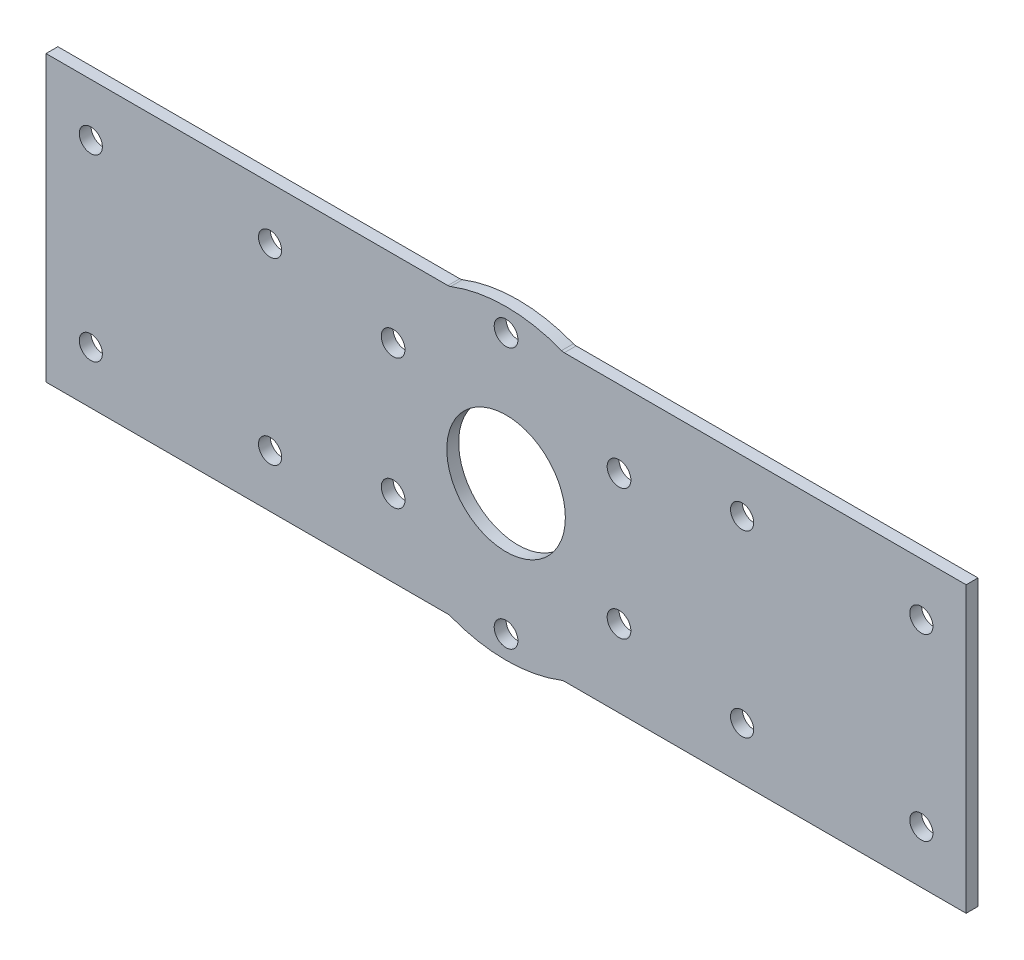
ISO-10303-21;
HEADER;
FILE_DESCRIPTION(('STEP AP214'),'2;1');
FILE_NAME('part.step','',(''),(''),'','','');
FILE_SCHEMA(('AUTOMOTIVE_DESIGN { 1 0 10303 214 1 1 1 1 }'));
ENDSEC;
DATA;
#1=APPLICATION_CONTEXT('core data for automotive mechanical design processes');
#2=APPLICATION_PROTOCOL_DEFINITION('international standard','automotive_design',2000,#1);
#3=PRODUCT_CONTEXT('',#1,'mechanical');
#4=PRODUCT('Part','Part','',(#3));
#5=PRODUCT_RELATED_PRODUCT_CATEGORY('part','',(#4));
#6=PRODUCT_DEFINITION_FORMATION('','',#4);
#7=PRODUCT_DEFINITION_CONTEXT('part definition',#1,'design');
#8=PRODUCT_DEFINITION('design','',#6,#7);
#9=PRODUCT_DEFINITION_SHAPE('','',#8);
#10=(LENGTH_UNIT() NAMED_UNIT(*) SI_UNIT(.MILLI.,.METRE.));
#11=(NAMED_UNIT(*) PLANE_ANGLE_UNIT() SI_UNIT($,.RADIAN.));
#12=(NAMED_UNIT(*) SI_UNIT($,.STERADIAN.) SOLID_ANGLE_UNIT());
#13=UNCERTAINTY_MEASURE_WITH_UNIT(LENGTH_MEASURE(1.E-05),#10,'distance_accuracy_value','');
#14=(GEOMETRIC_REPRESENTATION_CONTEXT(3) GLOBAL_UNCERTAINTY_ASSIGNED_CONTEXT((#13)) GLOBAL_UNIT_ASSIGNED_CONTEXT((#10,
#11,#12)) REPRESENTATION_CONTEXT('',''));
#15=CARTESIAN_POINT('',(0.,0.,0.));
#16=DIRECTION('',(0.,0.,1.));
#17=DIRECTION('',(1.,0.,0.));
#18=AXIS2_PLACEMENT_3D('',#15,#16,#17);
#19=CARTESIAN_POINT('',(0.,0.,1.5875));
#20=DIRECTION('',(0.,0.,-1.));
#21=DIRECTION('',(-1.,0.,0.));
#22=AXIS2_PLACEMENT_3D('',#19,#20,#21);
#23=PLANE('',#22);
#24=CARTESIAN_POINT('',(63.2023827408732,24.,1.5875));
#25=DIRECTION('',(0.,0.,-1.));
#26=DIRECTION('',(-1.,0.,0.));
#27=AXIS2_PLACEMENT_3D('',#24,#25,#26);
#28=CIRCLE('',#27,3.09999999999999);
#29=CARTESIAN_POINT('',(60.1023827408732,24.,1.5875));
#30=VERTEX_POINT('',#29);
#31=EDGE_CURVE('E1058',#30,#30,#28,.T.);
#32=ORIENTED_EDGE('',*,*,#31,.T.);
#33=EDGE_LOOP('',(#32));
#34=FACE_BOUND('',#33,.T.);
#35=CARTESIAN_POINT('',(111.202382740873,24.,1.5875));
#36=DIRECTION('',(0.,0.,1.));
#37=DIRECTION('',(1.,0.,0.));
#38=AXIS2_PLACEMENT_3D('',#35,#36,#37);
#39=CIRCLE('',#38,3.1);
#40=CARTESIAN_POINT('',(114.302382740873,24.,1.5875));
#41=VERTEX_POINT('',#40);
#42=EDGE_CURVE('E1004',#41,#41,#39,.F.);
#43=ORIENTED_EDGE('',*,*,#42,.T.);
#44=EDGE_LOOP('',(#43));
#45=FACE_BOUND('',#44,.T.);
#46=CARTESIAN_POINT('',(111.202382740873,-24.,1.5875));
#47=DIRECTION('',(0.,0.,1.));
#48=DIRECTION('',(1.,0.,0.));
#49=AXIS2_PLACEMENT_3D('',#46,#47,#48);
#50=CIRCLE('',#49,3.1);
#51=CARTESIAN_POINT('',(114.302382740873,-24.,1.5875));
#52=VERTEX_POINT('',#51);
#53=EDGE_CURVE('E999',#52,#52,#50,.F.);
#54=ORIENTED_EDGE('',*,*,#53,.T.);
#55=EDGE_LOOP('',(#54));
#56=FACE_BOUND('',#55,.T.);
#57=CARTESIAN_POINT('',(63.2023827408733,-24.,1.5875));
#58=DIRECTION('',(0.,0.,1.));
#59=DIRECTION('',(1.,0.,0.));
#60=AXIS2_PLACEMENT_3D('',#57,#58,#59);
#61=CIRCLE('',#60,3.1);
#62=CARTESIAN_POINT('',(66.3023827408733,-24.,1.5875));
#63=VERTEX_POINT('',#62);
#64=EDGE_CURVE('E995',#63,#63,#61,.F.);
#65=ORIENTED_EDGE('',*,*,#64,.T.);
#66=EDGE_LOOP('',(#65));
#67=FACE_BOUND('',#66,.T.);
#68=CARTESIAN_POINT('',(0.,0.,1.5875));
#69=DIRECTION('',(0.,0.,-1.));
#70=DIRECTION('',(-1.,0.,0.));
#71=AXIS2_PLACEMENT_3D('',#68,#69,#70);
#72=CIRCLE('',#71,41.021);
#73=CARTESIAN_POINT('',(-14.8575397339142,38.2357941470445,1.5875));
#74=VERTEX_POINT('',#73);
#75=CARTESIAN_POINT('',(14.8575397339142,38.2357941470445,1.5875));
#76=VERTEX_POINT('',#75);
#77=EDGE_CURVE('E539',#74,#76,#72,.T.);
#78=ORIENTED_EDGE('',*,*,#77,.F.);
#79=CARTESIAN_POINT('',(-15.5819267422229,40.1,1.5875));
#80=DIRECTION('',(0.,0.,-1.));
#81=DIRECTION('',(-1.,0.,0.));
#82=AXIS2_PLACEMENT_3D('',#79,#80,#81);
#83=CIRCLE('',#82,2.);
#84=CARTESIAN_POINT('',(-15.5819267422229,38.1,1.5875));
#85=VERTEX_POINT('',#84);
#86=EDGE_CURVE('E621',#74,#85,#83,.T.);
#87=ORIENTED_EDGE('',*,*,#86,.T.);
#88=DIRECTION('',(-1.,0.,0.));
#89=VECTOR('',#88,1.);
#90=CARTESIAN_POINT('',(-15.2023827408732,38.1,1.5875));
#91=LINE('',#90,#89);
#92=CARTESIAN_POINT('',(-123.202382740873,38.1,1.5875));
#93=VERTEX_POINT('',#92);
#94=EDGE_CURVE('E548',#85,#93,#91,.T.);
#95=ORIENTED_EDGE('',*,*,#94,.T.);
#96=DIRECTION('',(0.,-1.,0.));
#97=VECTOR('',#96,1.);
#98=CARTESIAN_POINT('',(-123.202382740873,38.1,1.5875));
#99=LINE('',#98,#97);
#100=CARTESIAN_POINT('',(-123.202382740873,-38.1,1.5875));
#101=VERTEX_POINT('',#100);
#102=EDGE_CURVE('E564',#93,#101,#99,.T.);
#103=ORIENTED_EDGE('',*,*,#102,.T.);
#104=DIRECTION('',(-1.,0.,0.));
#105=VECTOR('',#104,1.);
#106=CARTESIAN_POINT('',(-15.2023827408732,-38.1,1.5875));
#107=LINE('',#106,#105);
#108=CARTESIAN_POINT('',(-15.5819267422229,-38.1,1.5875));
#109=VERTEX_POINT('',#108);
#110=EDGE_CURVE('E562',#109,#101,#107,.T.);
#111=ORIENTED_EDGE('',*,*,#110,.F.);
#112=CARTESIAN_POINT('',(-15.5819267422229,-40.1,1.5875));
#113=DIRECTION('',(0.,0.,-1.));
#114=DIRECTION('',(-1.,0.,0.));
#115=AXIS2_PLACEMENT_3D('',#112,#113,#114);
#116=CIRCLE('',#115,2.);
#117=CARTESIAN_POINT('',(-14.8575397339142,-38.2357941470445,1.5875));
#118=VERTEX_POINT('',#117);
#119=EDGE_CURVE('E614',#109,#118,#116,.T.);
#120=ORIENTED_EDGE('',*,*,#119,.T.);
#121=CARTESIAN_POINT('',(0.,0.,1.5875));
#122=DIRECTION('',(0.,0.,1.));
#123=DIRECTION('',(1.,0.,0.));
#124=AXIS2_PLACEMENT_3D('',#121,#122,#123);
#125=CIRCLE('',#124,41.021);
#126=CARTESIAN_POINT('',(14.8575397339142,-38.2357941470445,1.5875));
#127=VERTEX_POINT('',#126);
#128=EDGE_CURVE('E560',#118,#127,#125,.T.);
#129=ORIENTED_EDGE('',*,*,#128,.T.);
#130=CARTESIAN_POINT('',(15.5819267422229,-40.1,1.5875));
#131=DIRECTION('',(0.,0.,-1.));
#132=DIRECTION('',(-1.,0.,0.));
#133=AXIS2_PLACEMENT_3D('',#130,#131,#132);
#134=CIRCLE('',#133,2.);
#135=CARTESIAN_POINT('',(15.5819267422229,-38.1,1.5875));
#136=VERTEX_POINT('',#135);
#137=EDGE_CURVE('E618',#127,#136,#134,.T.);
#138=ORIENTED_EDGE('',*,*,#137,.T.);
#139=DIRECTION('',(1.,0.,0.));
#140=VECTOR('',#139,1.);
#141=CARTESIAN_POINT('',(15.2023827408732,-38.1,1.5875));
#142=LINE('',#141,#140);
#143=CARTESIAN_POINT('',(123.202382740873,-38.1,1.5875));
#144=VERTEX_POINT('',#143);
#145=EDGE_CURVE('E551',#136,#144,#142,.T.);
#146=ORIENTED_EDGE('',*,*,#145,.T.);
#147=DIRECTION('',(0.,-1.,0.));
#148=VECTOR('',#147,1.);
#149=CARTESIAN_POINT('',(123.202382740873,38.1,1.5875));
#150=LINE('',#149,#148);
#151=CARTESIAN_POINT('',(123.202382740873,38.1,1.5875));
#152=VERTEX_POINT('',#151);
#153=EDGE_CURVE('E537',#152,#144,#150,.T.);
#154=ORIENTED_EDGE('',*,*,#153,.F.);
#155=DIRECTION('',(1.,0.,0.));
#156=VECTOR('',#155,1.);
#157=CARTESIAN_POINT('',(15.2023827408732,38.1,1.5875));
#158=LINE('',#157,#156);
#159=CARTESIAN_POINT('',(15.5819267422229,38.1,1.5875));
#160=VERTEX_POINT('',#159);
#161=EDGE_CURVE('E533',#160,#152,#158,.T.);
#162=ORIENTED_EDGE('',*,*,#161,.F.);
#163=CARTESIAN_POINT('',(15.5819267422229,40.1,1.5875));
#164=DIRECTION('',(0.,0.,-1.));
#165=DIRECTION('',(-1.,0.,0.));
#166=AXIS2_PLACEMENT_3D('',#163,#164,#165);
#167=CIRCLE('',#166,2.);
#168=EDGE_CURVE('E12',#160,#76,#167,.T.);
#169=ORIENTED_EDGE('',*,*,#168,.T.);
#170=EDGE_LOOP('',(#78,#87,#95,#103,#111,#120,#129,#138,#146,#154,#162,#169));
#171=FACE_BOUND('',#170,.T.);
#172=CARTESIAN_POINT('',(-63.2023827408732,24.,1.5875));
#173=DIRECTION('',(0.,0.,1.));
#174=DIRECTION('',(1.,0.,0.));
#175=AXIS2_PLACEMENT_3D('',#172,#173,#174);
#176=CIRCLE('',#175,3.09999999999999);
#177=CARTESIAN_POINT('',(-60.1023827408732,24.,1.5875));
#178=VERTEX_POINT('',#177);
#179=EDGE_CURVE('E575',#178,#178,#176,.T.);
#180=ORIENTED_EDGE('',*,*,#179,.F.);
#181=EDGE_LOOP('',(#180));
#182=FACE_BOUND('',#181,.T.);
#183=CARTESIAN_POINT('',(-63.2023827408733,-24.,1.5875));
#184=DIRECTION('',(0.,0.,1.));
#185=DIRECTION('',(1.,0.,0.));
#186=AXIS2_PLACEMENT_3D('',#183,#184,#185);
#187=CIRCLE('',#186,3.1);
#188=CARTESIAN_POINT('',(-60.1023827408732,-24.,1.5875));
#189=VERTEX_POINT('',#188);
#190=EDGE_CURVE('E1011',#189,#189,#187,.T.);
#191=ORIENTED_EDGE('',*,*,#190,.F.);
#192=EDGE_LOOP('',(#191));
#193=FACE_BOUND('',#192,.T.);
#194=CARTESIAN_POINT('',(-30.2459372271713,17.4625000000004,1.5875));
#195=DIRECTION('',(0.,0.,1.));
#196=DIRECTION('',(1.,0.,0.));
#197=AXIS2_PLACEMENT_3D('',#194,#195,#196);
#198=CIRCLE('',#197,3.175);
#199=CARTESIAN_POINT('',(-27.0709372271713,17.4625000000004,1.5875));
#200=VERTEX_POINT('',#199);
#201=EDGE_CURVE('E1020',#200,#200,#198,.T.);
#202=ORIENTED_EDGE('',*,*,#201,.F.);
#203=EDGE_LOOP('',(#202));
#204=FACE_BOUND('',#203,.T.);
#205=CARTESIAN_POINT('',(30.2459372271716,17.4624999999999,1.5875));
#206=DIRECTION('',(0.,0.,1.));
#207=DIRECTION('',(1.,0.,0.));
#208=AXIS2_PLACEMENT_3D('',#205,#206,#207);
#209=CIRCLE('',#208,3.175);
#210=CARTESIAN_POINT('',(33.4209372271716,17.4624999999999,1.5875));
#211=VERTEX_POINT('',#210);
#212=EDGE_CURVE('E1021',#211,#211,#209,.T.);
#213=ORIENTED_EDGE('',*,*,#212,.F.);
#214=EDGE_LOOP('',(#213));
#215=FACE_BOUND('',#214,.T.);
#216=CARTESIAN_POINT('',(30.2459372271714,-17.4625000000001,1.5875));
#217=DIRECTION('',(0.,0.,1.));
#218=DIRECTION('',(1.,0.,0.));
#219=AXIS2_PLACEMENT_3D('',#216,#217,#218);
#220=CIRCLE('',#219,3.175);
#221=CARTESIAN_POINT('',(33.4209372271714,-17.4625000000001,1.5875));
#222=VERTEX_POINT('',#221);
#223=EDGE_CURVE('E1029',#222,#222,#220,.T.);
#224=ORIENTED_EDGE('',*,*,#223,.F.);
#225=EDGE_LOOP('',(#224));
#226=FACE_BOUND('',#225,.T.);
#227=CARTESIAN_POINT('',(-30.2459372271693,-17.4625000000013,1.5875));
#228=DIRECTION('',(0.,0.,1.));
#229=DIRECTION('',(1.,0.,0.));
#230=AXIS2_PLACEMENT_3D('',#227,#228,#229);
#231=CIRCLE('',#230,3.17500000000282);
#232=CARTESIAN_POINT('',(-27.0709372271665,-17.4625000000013,1.5875));
#233=VERTEX_POINT('',#232);
#234=EDGE_CURVE('E1034',#233,#233,#231,.T.);
#235=ORIENTED_EDGE('',*,*,#234,.F.);
#236=EDGE_LOOP('',(#235));
#237=FACE_BOUND('',#236,.T.);
#238=CARTESIAN_POINT('',(0.,0.,1.5875));
#239=DIRECTION('',(0.,0.,1.));
#240=DIRECTION('',(1.,0.,0.));
#241=AXIS2_PLACEMENT_3D('',#238,#239,#240);
#242=CIRCLE('',#241,15.875);
#243=CARTESIAN_POINT('',(15.875,0.,1.5875));
#244=VERTEX_POINT('',#243);
#245=EDGE_CURVE('E1041',#244,#244,#242,.T.);
#246=ORIENTED_EDGE('',*,*,#245,.F.);
#247=EDGE_LOOP('',(#246));
#248=FACE_BOUND('',#247,.T.);
#249=CARTESIAN_POINT('',(-111.202382740873,-24.,1.5875));
#250=DIRECTION('',(0.,0.,1.));
#251=DIRECTION('',(1.,0.,0.));
#252=AXIS2_PLACEMENT_3D('',#249,#250,#251);
#253=CIRCLE('',#252,3.1);
#254=CARTESIAN_POINT('',(-108.102382740873,-24.,1.5875));
#255=VERTEX_POINT('',#254);
#256=EDGE_CURVE('E1050',#255,#255,#253,.T.);
#257=ORIENTED_EDGE('',*,*,#256,.F.);
#258=EDGE_LOOP('',(#257));
#259=FACE_BOUND('',#258,.T.);
#260=CARTESIAN_POINT('',(-111.202382740873,24.,1.5875));
#261=DIRECTION('',(0.,0.,1.));
#262=DIRECTION('',(1.,0.,0.));
#263=AXIS2_PLACEMENT_3D('',#260,#261,#262);
#264=CIRCLE('',#263,3.1);
#265=CARTESIAN_POINT('',(-108.102382740873,24.,1.5875));
#266=VERTEX_POINT('',#265);
#267=EDGE_CURVE('E1052',#266,#266,#264,.T.);
#268=ORIENTED_EDGE('',*,*,#267,.F.);
#269=EDGE_LOOP('',(#268));
#270=FACE_BOUND('',#269,.T.);
#271=CARTESIAN_POINT('',(0.,34.925,1.5875));
#272=DIRECTION('',(0.,0.,1.));
#273=DIRECTION('',(1.,0.,0.));
#274=AXIS2_PLACEMENT_3D('',#271,#272,#273);
#275=CIRCLE('',#274,3.175);
#276=CARTESIAN_POINT('',(3.175,34.925,1.5875));
#277=VERTEX_POINT('',#276);
#278=EDGE_CURVE('E1063',#277,#277,#275,.T.);
#279=ORIENTED_EDGE('',*,*,#278,.F.);
#280=EDGE_LOOP('',(#279));
#281=FACE_BOUND('',#280,.T.);
#282=CARTESIAN_POINT('',(0.,-34.9250000000002,1.5875));
#283=DIRECTION('',(0.,0.,1.));
#284=DIRECTION('',(1.,0.,0.));
#285=AXIS2_PLACEMENT_3D('',#282,#283,#284);
#286=CIRCLE('',#285,3.17500000000011);
#287=CARTESIAN_POINT('',(3.17500000000002,-34.9250000000002,1.5875));
#288=VERTEX_POINT('',#287);
#289=EDGE_CURVE('E1069',#288,#288,#286,.T.);
#290=ORIENTED_EDGE('',*,*,#289,.F.);
#291=EDGE_LOOP('',(#290));
#292=FACE_BOUND('',#291,.T.);
#293=ADVANCED_FACE('F446',(#34,#45,#56,#67,#171,#182,#193,#204,#215,#226,#237,#248,#259,#270,
#281,#292),#23,.F.);
#294=CARTESIAN_POINT('',(0.,0.,-1.5875));
#295=DIRECTION('',(0.,0.,-1.));
#296=DIRECTION('',(-1.,0.,0.));
#297=AXIS2_PLACEMENT_3D('',#294,#295,#296);
#298=PLANE('',#297);
#299=CARTESIAN_POINT('',(0.,34.925,-1.5875));
#300=DIRECTION('',(0.,0.,1.));
#301=DIRECTION('',(1.,0.,0.));
#302=AXIS2_PLACEMENT_3D('',#299,#300,#301);
#303=CIRCLE('',#302,3.175);
#304=CARTESIAN_POINT('',(3.175,34.925,-1.5875));
#305=VERTEX_POINT('',#304);
#306=EDGE_CURVE('E1070',#305,#305,#303,.T.);
#307=ORIENTED_EDGE('',*,*,#306,.T.);
#308=EDGE_LOOP('',(#307));
#309=FACE_BOUND('',#308,.T.);
#310=CARTESIAN_POINT('',(63.2023827408732,24.,-1.5875));
#311=DIRECTION('',(0.,0.,-1.));
#312=DIRECTION('',(-1.,0.,0.));
#313=AXIS2_PLACEMENT_3D('',#310,#311,#312);
#314=CIRCLE('',#313,3.09999999999999);
#315=CARTESIAN_POINT('',(60.1023827408732,24.,-1.5875));
#316=VERTEX_POINT('',#315);
#317=EDGE_CURVE('E1065',#316,#316,#314,.T.);
#318=ORIENTED_EDGE('',*,*,#317,.F.);
#319=EDGE_LOOP('',(#318));
#320=FACE_BOUND('',#319,.T.);
#321=CARTESIAN_POINT('',(-111.202382740873,-24.,-1.5875));
#322=DIRECTION('',(0.,0.,1.));
#323=DIRECTION('',(1.,0.,0.));
#324=AXIS2_PLACEMENT_3D('',#321,#322,#323);
#325=CIRCLE('',#324,3.1);
#326=CARTESIAN_POINT('',(-108.102382740873,-24.,-1.5875));
#327=VERTEX_POINT('',#326);
#328=EDGE_CURVE('E1048',#327,#327,#325,.T.);
#329=ORIENTED_EDGE('',*,*,#328,.T.);
#330=EDGE_LOOP('',(#329));
#331=FACE_BOUND('',#330,.T.);
#332=CARTESIAN_POINT('',(-30.2459372271693,-17.4625000000013,-1.5875));
#333=DIRECTION('',(0.,0.,1.));
#334=DIRECTION('',(1.,0.,0.));
#335=AXIS2_PLACEMENT_3D('',#332,#333,#334);
#336=CIRCLE('',#335,3.17500000000282);
#337=CARTESIAN_POINT('',(-27.0709372271665,-17.4625000000013,-1.5875));
#338=VERTEX_POINT('',#337);
#339=EDGE_CURVE('E1038',#338,#338,#336,.T.);
#340=ORIENTED_EDGE('',*,*,#339,.T.);
#341=EDGE_LOOP('',(#340));
#342=FACE_BOUND('',#341,.T.);
#343=CARTESIAN_POINT('',(30.2459372271716,17.4624999999999,-1.5875));
#344=DIRECTION('',(0.,0.,1.));
#345=DIRECTION('',(1.,0.,0.));
#346=AXIS2_PLACEMENT_3D('',#343,#344,#345);
#347=CIRCLE('',#346,3.175);
#348=CARTESIAN_POINT('',(33.4209372271716,17.4624999999999,-1.5875));
#349=VERTEX_POINT('',#348);
#350=EDGE_CURVE('E1028',#349,#349,#347,.T.);
#351=ORIENTED_EDGE('',*,*,#350,.T.);
#352=EDGE_LOOP('',(#351));
#353=FACE_BOUND('',#352,.T.);
#354=CARTESIAN_POINT('',(-63.2023827408733,-24.,-1.5875));
#355=DIRECTION('',(0.,0.,1.));
#356=DIRECTION('',(1.,0.,0.));
#357=AXIS2_PLACEMENT_3D('',#354,#355,#356);
#358=CIRCLE('',#357,3.1);
#359=CARTESIAN_POINT('',(-60.1023827408732,-24.,-1.5875));
#360=VERTEX_POINT('',#359);
#361=EDGE_CURVE('E1013',#360,#360,#358,.T.);
#362=ORIENTED_EDGE('',*,*,#361,.T.);
#363=EDGE_LOOP('',(#362));
#364=FACE_BOUND('',#363,.T.);
#365=CARTESIAN_POINT('',(111.202382740873,24.,-1.5875));
#366=DIRECTION('',(0.,0.,1.));
#367=DIRECTION('',(1.,0.,0.));
#368=AXIS2_PLACEMENT_3D('',#365,#366,#367);
#369=CIRCLE('',#368,3.1);
#370=CARTESIAN_POINT('',(114.302382740873,24.,-1.5875));
#371=VERTEX_POINT('',#370);
#372=EDGE_CURVE('E1006',#371,#371,#369,.F.);
#373=ORIENTED_EDGE('',*,*,#372,.F.);
#374=EDGE_LOOP('',(#373));
#375=FACE_BOUND('',#374,.T.);
#376=CARTESIAN_POINT('',(111.202382740873,-24.,-1.5875));
#377=DIRECTION('',(0.,0.,1.));
#378=DIRECTION('',(1.,0.,0.));
#379=AXIS2_PLACEMENT_3D('',#376,#377,#378);
#380=CIRCLE('',#379,3.1);
#381=CARTESIAN_POINT('',(114.302382740873,-24.,-1.5875));
#382=VERTEX_POINT('',#381);
#383=EDGE_CURVE('E1005',#382,#382,#380,.F.);
#384=ORIENTED_EDGE('',*,*,#383,.F.);
#385=EDGE_LOOP('',(#384));
#386=FACE_BOUND('',#385,.T.);
#387=CARTESIAN_POINT('',(63.2023827408733,-24.,-1.5875));
#388=DIRECTION('',(0.,0.,1.));
#389=DIRECTION('',(1.,0.,0.));
#390=AXIS2_PLACEMENT_3D('',#387,#388,#389);
#391=CIRCLE('',#390,3.1);
#392=CARTESIAN_POINT('',(66.3023827408733,-24.,-1.5875));
#393=VERTEX_POINT('',#392);
#394=EDGE_CURVE('E996',#393,#393,#391,.F.);
#395=ORIENTED_EDGE('',*,*,#394,.F.);
#396=EDGE_LOOP('',(#395));
#397=FACE_BOUND('',#396,.T.);
#398=DIRECTION('',(-1.,0.,0.));
#399=VECTOR('',#398,1.);
#400=CARTESIAN_POINT('',(-15.2023827408732,38.1,-1.5875));
#401=LINE('',#400,#399);
#402=CARTESIAN_POINT('',(-15.5819267422229,38.1,-1.5875));
#403=VERTEX_POINT('',#402);
#404=CARTESIAN_POINT('',(-123.202382740873,38.1,-1.5875));
#405=VERTEX_POINT('',#404);
#406=EDGE_CURVE('E584',#403,#405,#401,.T.);
#407=ORIENTED_EDGE('',*,*,#406,.F.);
#408=CARTESIAN_POINT('',(-15.5819267422229,40.1,-1.5875));
#409=DIRECTION('',(0.,0.,-1.));
#410=DIRECTION('',(-1.,0.,0.));
#411=AXIS2_PLACEMENT_3D('',#408,#409,#410);
#412=CIRCLE('',#411,2.);
#413=CARTESIAN_POINT('',(-14.8575397339142,38.2357941470445,-1.5875));
#414=VERTEX_POINT('',#413);
#415=EDGE_CURVE('E622',#403,#414,#412,.F.);
#416=ORIENTED_EDGE('',*,*,#415,.T.);
#417=CARTESIAN_POINT('',(0.,0.,-1.5875));
#418=DIRECTION('',(0.,0.,-1.));
#419=DIRECTION('',(-1.,0.,0.));
#420=AXIS2_PLACEMENT_3D('',#417,#418,#419);
#421=CIRCLE('',#420,41.021);
#422=CARTESIAN_POINT('',(14.8575397339142,38.2357941470445,-1.5875));
#423=VERTEX_POINT('',#422);
#424=EDGE_CURVE('E569',#414,#423,#421,.T.);
#425=ORIENTED_EDGE('',*,*,#424,.T.);
#426=CARTESIAN_POINT('',(15.5819267422229,40.1,-1.5875));
#427=DIRECTION('',(0.,0.,-1.));
#428=DIRECTION('',(-1.,0.,0.));
#429=AXIS2_PLACEMENT_3D('',#426,#427,#428);
#430=CIRCLE('',#429,2.);
#431=CARTESIAN_POINT('',(15.5819267422229,38.1,-1.5875));
#432=VERTEX_POINT('',#431);
#433=EDGE_CURVE('E453',#423,#432,#430,.F.);
#434=ORIENTED_EDGE('',*,*,#433,.T.);
#435=DIRECTION('',(1.,0.,0.));
#436=VECTOR('',#435,1.);
#437=CARTESIAN_POINT('',(15.2023827408732,38.1,-1.5875));
#438=LINE('',#437,#436);
#439=CARTESIAN_POINT('',(123.202382740873,38.1,-1.5875));
#440=VERTEX_POINT('',#439);
#441=EDGE_CURVE('E571',#432,#440,#438,.T.);
#442=ORIENTED_EDGE('',*,*,#441,.T.);
#443=DIRECTION('',(0.,-1.,0.));
#444=VECTOR('',#443,1.);
#445=CARTESIAN_POINT('',(123.202382740873,38.1,-1.5875));
#446=LINE('',#445,#444);
#447=CARTESIAN_POINT('',(123.202382740873,-38.1,-1.5875));
#448=VERTEX_POINT('',#447);
#449=EDGE_CURVE('E550',#440,#448,#446,.T.);
#450=ORIENTED_EDGE('',*,*,#449,.T.);
#451=DIRECTION('',(1.,0.,0.));
#452=VECTOR('',#451,1.);
#453=CARTESIAN_POINT('',(15.2023827408732,-38.1,-1.5875));
#454=LINE('',#453,#452);
#455=CARTESIAN_POINT('',(15.5819267422229,-38.1,-1.5875));
#456=VERTEX_POINT('',#455);
#457=EDGE_CURVE('E574',#456,#448,#454,.T.);
#458=ORIENTED_EDGE('',*,*,#457,.F.);
#459=CARTESIAN_POINT('',(15.5819267422229,-40.1,-1.5875));
#460=DIRECTION('',(0.,0.,-1.));
#461=DIRECTION('',(-1.,0.,0.));
#462=AXIS2_PLACEMENT_3D('',#459,#460,#461);
#463=CIRCLE('',#462,2.);
#464=CARTESIAN_POINT('',(14.8575397339142,-38.2357941470445,-1.5875));
#465=VERTEX_POINT('',#464);
#466=EDGE_CURVE('E620',#456,#465,#463,.F.);
#467=ORIENTED_EDGE('',*,*,#466,.T.);
#468=CARTESIAN_POINT('',(0.,0.,-1.5875));
#469=DIRECTION('',(0.,0.,1.));
#470=DIRECTION('',(1.,0.,0.));
#471=AXIS2_PLACEMENT_3D('',#468,#469,#470);
#472=CIRCLE('',#471,41.021);
#473=CARTESIAN_POINT('',(-14.8575397339142,-38.2357941470445,-1.5875));
#474=VERTEX_POINT('',#473);
#475=EDGE_CURVE('E580',#474,#465,#472,.T.);
#476=ORIENTED_EDGE('',*,*,#475,.F.);
#477=CARTESIAN_POINT('',(-15.5819267422229,-40.1,-1.5875));
#478=DIRECTION('',(0.,0.,-1.));
#479=DIRECTION('',(-1.,0.,0.));
#480=AXIS2_PLACEMENT_3D('',#477,#478,#479);
#481=CIRCLE('',#480,2.);
#482=CARTESIAN_POINT('',(-15.5819267422229,-38.1,-1.5875));
#483=VERTEX_POINT('',#482);
#484=EDGE_CURVE('E612',#474,#483,#481,.F.);
#485=ORIENTED_EDGE('',*,*,#484,.T.);
#486=DIRECTION('',(-1.,0.,0.));
#487=VECTOR('',#486,1.);
#488=CARTESIAN_POINT('',(-15.2023827408732,-38.1,-1.5875));
#489=LINE('',#488,#487);
#490=CARTESIAN_POINT('',(-123.202382740873,-38.1,-1.5875));
#491=VERTEX_POINT('',#490);
#492=EDGE_CURVE('E579',#483,#491,#489,.T.);
#493=ORIENTED_EDGE('',*,*,#492,.T.);
#494=DIRECTION('',(0.,-1.,0.));
#495=VECTOR('',#494,1.);
#496=CARTESIAN_POINT('',(-123.202382740873,38.1,-1.5875));
#497=LINE('',#496,#495);
#498=EDGE_CURVE('E582',#405,#491,#497,.T.);
#499=ORIENTED_EDGE('',*,*,#498,.F.);
#500=EDGE_LOOP('',(#407,#416,#425,#434,#442,#450,#458,#467,#476,#485,#493,#499));
#501=FACE_BOUND('',#500,.T.);
#502=CARTESIAN_POINT('',(-63.2023827408732,24.,-1.5875));
#503=DIRECTION('',(0.,0.,1.));
#504=DIRECTION('',(1.,0.,0.));
#505=AXIS2_PLACEMENT_3D('',#502,#503,#504);
#506=CIRCLE('',#505,3.09999999999999);
#507=CARTESIAN_POINT('',(-60.1023827408732,24.,-1.5875));
#508=VERTEX_POINT('',#507);
#509=EDGE_CURVE('E992',#508,#508,#506,.T.);
#510=ORIENTED_EDGE('',*,*,#509,.T.);
#511=EDGE_LOOP('',(#510));
#512=FACE_BOUND('',#511,.T.);
#513=CARTESIAN_POINT('',(-30.2459372271713,17.4625000000004,-1.5875));
#514=DIRECTION('',(0.,0.,1.));
#515=DIRECTION('',(1.,0.,0.));
#516=AXIS2_PLACEMENT_3D('',#513,#514,#515);
#517=CIRCLE('',#516,3.175);
#518=CARTESIAN_POINT('',(-27.0709372271713,17.4625000000004,-1.5875));
#519=VERTEX_POINT('',#518);
#520=EDGE_CURVE('E1019',#519,#519,#517,.T.);
#521=ORIENTED_EDGE('',*,*,#520,.T.);
#522=EDGE_LOOP('',(#521));
#523=FACE_BOUND('',#522,.T.);
#524=CARTESIAN_POINT('',(30.2459372271714,-17.4625000000001,-1.5875));
#525=DIRECTION('',(0.,0.,1.));
#526=DIRECTION('',(1.,0.,0.));
#527=AXIS2_PLACEMENT_3D('',#524,#525,#526);
#528=CIRCLE('',#527,3.175);
#529=CARTESIAN_POINT('',(33.4209372271714,-17.4625000000001,-1.5875));
#530=VERTEX_POINT('',#529);
#531=EDGE_CURVE('E1035',#530,#530,#528,.T.);
#532=ORIENTED_EDGE('',*,*,#531,.T.);
#533=EDGE_LOOP('',(#532));
#534=FACE_BOUND('',#533,.T.);
#535=CARTESIAN_POINT('',(0.,0.,-1.5875));
#536=DIRECTION('',(0.,0.,1.));
#537=DIRECTION('',(1.,0.,0.));
#538=AXIS2_PLACEMENT_3D('',#535,#536,#537);
#539=CIRCLE('',#538,15.875);
#540=CARTESIAN_POINT('',(15.875,0.,-1.5875));
#541=VERTEX_POINT('',#540);
#542=EDGE_CURVE('E1043',#541,#541,#539,.T.);
#543=ORIENTED_EDGE('',*,*,#542,.T.);
#544=EDGE_LOOP('',(#543));
#545=FACE_BOUND('',#544,.T.);
#546=CARTESIAN_POINT('',(-111.202382740873,24.,-1.5875));
#547=DIRECTION('',(0.,0.,1.));
#548=DIRECTION('',(1.,0.,0.));
#549=AXIS2_PLACEMENT_3D('',#546,#547,#548);
#550=CIRCLE('',#549,3.1);
#551=CARTESIAN_POINT('',(-108.102382740873,24.,-1.5875));
#552=VERTEX_POINT('',#551);
#553=EDGE_CURVE('E1056',#552,#552,#550,.T.);
#554=ORIENTED_EDGE('',*,*,#553,.T.);
#555=EDGE_LOOP('',(#554));
#556=FACE_BOUND('',#555,.T.);
#557=CARTESIAN_POINT('',(0.,-34.9250000000002,-1.5875));
#558=DIRECTION('',(0.,0.,1.));
#559=DIRECTION('',(1.,0.,0.));
#560=AXIS2_PLACEMENT_3D('',#557,#558,#559);
#561=CIRCLE('',#560,3.17500000000011);
#562=CARTESIAN_POINT('',(3.17500000000002,-34.9250000000002,-1.5875));
#563=VERTEX_POINT('',#562);
#564=EDGE_CURVE('E1072',#563,#563,#561,.T.);
#565=ORIENTED_EDGE('',*,*,#564,.T.);
#566=EDGE_LOOP('',(#565));
#567=FACE_BOUND('',#566,.T.);
#568=ADVANCED_FACE('F637',(#309,#320,#331,#342,#353,#364,#375,#386,#397,#501,#512,#523,#534,
#545,#556,#567),#298,.T.);
#569=CARTESIAN_POINT('',(0.,0.,1.5875));
#570=DIRECTION('',(0.,0.,-1.));
#571=DIRECTION('',(-1.,0.,0.));
#572=AXIS2_PLACEMENT_3D('',#569,#570,#571);
#573=CYLINDRICAL_SURFACE('',#572,41.021);
#574=ORIENTED_EDGE('',*,*,#424,.F.);
#575=DIRECTION('',(0.,0.,-1.));
#576=VECTOR('',#575,1.);
#577=CARTESIAN_POINT('',(-14.8575397339142,38.2357941470445,1.5875));
#578=LINE('',#577,#576);
#579=EDGE_CURVE('E608',#414,#74,#578,.F.);
#580=ORIENTED_EDGE('',*,*,#579,.T.);
#581=ORIENTED_EDGE('',*,*,#77,.T.);
#582=DIRECTION('',(0.,0.,-1.));
#583=VECTOR('',#582,1.);
#584=CARTESIAN_POINT('',(14.8575397339142,38.2357941470445,1.5875));
#585=LINE('',#584,#583);
#586=EDGE_CURVE('E610',#76,#423,#585,.T.);
#587=ORIENTED_EDGE('',*,*,#586,.T.);
#588=EDGE_LOOP('',(#574,#580,#581,#587));
#589=FACE_BOUND('',#588,.T.);
#590=ADVANCED_FACE('F643',(#589),#573,.T.);
#591=CARTESIAN_POINT('',(-15.2023827408732,38.1,1.5875));
#592=DIRECTION('',(0.,-1.,0.));
#593=DIRECTION('',(0.,0.,-1.));
#594=AXIS2_PLACEMENT_3D('',#591,#592,#593);
#595=PLANE('',#594);
#596=ORIENTED_EDGE('',*,*,#94,.F.);
#597=DIRECTION('',(0.,0.,-1.));
#598=VECTOR('',#597,1.);
#599=CARTESIAN_POINT('',(-15.5819267422229,38.1,1.5875));
#600=LINE('',#599,#598);
#601=EDGE_CURVE('E603',#85,#403,#600,.T.);
#602=ORIENTED_EDGE('',*,*,#601,.T.);
#603=ORIENTED_EDGE('',*,*,#406,.T.);
#604=DIRECTION('',(0.,0.,-1.));
#605=VECTOR('',#604,1.);
#606=CARTESIAN_POINT('',(-123.202382740873,38.1,1.5875));
#607=LINE('',#606,#605);
#608=EDGE_CURVE('E590',#93,#405,#607,.T.);
#609=ORIENTED_EDGE('',*,*,#608,.F.);
#610=EDGE_LOOP('',(#596,#602,#603,#609));
#611=FACE_BOUND('',#610,.T.);
#612=ADVANCED_FACE('F635',(#611),#595,.F.);
#613=CARTESIAN_POINT('',(-123.202382740873,38.1,1.5875));
#614=DIRECTION('',(1.,0.,0.));
#615=DIRECTION('',(0.,0.,-1.));
#616=AXIS2_PLACEMENT_3D('',#613,#614,#615);
#617=PLANE('',#616);
#618=ORIENTED_EDGE('',*,*,#498,.T.);
#619=DIRECTION('',(0.,0.,-1.));
#620=VECTOR('',#619,1.);
#621=CARTESIAN_POINT('',(-123.202382740873,-38.1,1.5875));
#622=LINE('',#621,#620);
#623=EDGE_CURVE('E591',#101,#491,#622,.T.);
#624=ORIENTED_EDGE('',*,*,#623,.F.);
#625=ORIENTED_EDGE('',*,*,#102,.F.);
#626=ORIENTED_EDGE('',*,*,#608,.T.);
#627=EDGE_LOOP('',(#618,#624,#625,#626));
#628=FACE_BOUND('',#627,.T.);
#629=ADVANCED_FACE('F666',(#628),#617,.F.);
#630=CARTESIAN_POINT('',(-15.2023827408732,-38.1,1.5875));
#631=DIRECTION('',(0.,-1.,0.));
#632=DIRECTION('',(0.,0.,-1.));
#633=AXIS2_PLACEMENT_3D('',#630,#631,#632);
#634=PLANE('',#633);
#635=ORIENTED_EDGE('',*,*,#492,.F.);
#636=DIRECTION('',(0.,0.,-1.));
#637=VECTOR('',#636,1.);
#638=CARTESIAN_POINT('',(-15.5819267422229,-38.1,1.5875));
#639=LINE('',#638,#637);
#640=EDGE_CURVE('E597',#483,#109,#639,.F.);
#641=ORIENTED_EDGE('',*,*,#640,.T.);
#642=ORIENTED_EDGE('',*,*,#110,.T.);
#643=ORIENTED_EDGE('',*,*,#623,.T.);
#644=EDGE_LOOP('',(#635,#641,#642,#643));
#645=FACE_BOUND('',#644,.T.);
#646=ADVANCED_FACE('F668',(#645),#634,.T.);
#647=CARTESIAN_POINT('',(0.,0.,1.5875));
#648=DIRECTION('',(0.,0.,-1.));
#649=DIRECTION('',(-1.,0.,0.));
#650=AXIS2_PLACEMENT_3D('',#647,#648,#649);
#651=CYLINDRICAL_SURFACE('',#650,41.021);
#652=ORIENTED_EDGE('',*,*,#128,.F.);
#653=DIRECTION('',(0.,0.,-1.));
#654=VECTOR('',#653,1.);
#655=CARTESIAN_POINT('',(-14.8575397339142,-38.2357941470445,1.5875));
#656=LINE('',#655,#654);
#657=EDGE_CURVE('E596',#118,#474,#656,.T.);
#658=ORIENTED_EDGE('',*,*,#657,.T.);
#659=ORIENTED_EDGE('',*,*,#475,.T.);
#660=DIRECTION('',(0.,0.,-1.));
#661=VECTOR('',#660,1.);
#662=CARTESIAN_POINT('',(14.8575397339142,-38.2357941470445,1.5875));
#663=LINE('',#662,#661);
#664=EDGE_CURVE('E587',#465,#127,#663,.F.);
#665=ORIENTED_EDGE('',*,*,#664,.T.);
#666=EDGE_LOOP('',(#652,#658,#659,#665));
#667=FACE_BOUND('',#666,.T.);
#668=ADVANCED_FACE('F672',(#667),#651,.T.);
#669=CARTESIAN_POINT('',(15.2023827408732,-38.1,1.5875));
#670=DIRECTION('',(0.,1.,0.));
#671=DIRECTION('',(0.,0.,1.));
#672=AXIS2_PLACEMENT_3D('',#669,#670,#671);
#673=PLANE('',#672);
#674=ORIENTED_EDGE('',*,*,#145,.F.);
#675=DIRECTION('',(0.,0.,1.));
#676=VECTOR('',#675,1.);
#677=CARTESIAN_POINT('',(15.5819267422229,-38.1,-1.5875));
#678=LINE('',#677,#676);
#679=EDGE_CURVE('E601',#136,#456,#678,.F.);
#680=ORIENTED_EDGE('',*,*,#679,.T.);
#681=ORIENTED_EDGE('',*,*,#457,.T.);
#682=DIRECTION('',(0.,0.,-1.));
#683=VECTOR('',#682,1.);
#684=CARTESIAN_POINT('',(123.202382740873,-38.1,1.5875));
#685=LINE('',#684,#683);
#686=EDGE_CURVE('E547',#144,#448,#685,.T.);
#687=ORIENTED_EDGE('',*,*,#686,.F.);
#688=EDGE_LOOP('',(#674,#680,#681,#687));
#689=FACE_BOUND('',#688,.T.);
#690=ADVANCED_FACE('F680',(#689),#673,.F.);
#691=CARTESIAN_POINT('',(123.202382740873,38.1,1.5875));
#692=DIRECTION('',(1.,0.,0.));
#693=DIRECTION('',(0.,0.,-1.));
#694=AXIS2_PLACEMENT_3D('',#691,#692,#693);
#695=PLANE('',#694);
#696=ORIENTED_EDGE('',*,*,#449,.F.);
#697=DIRECTION('',(0.,0.,-1.));
#698=VECTOR('',#697,1.);
#699=CARTESIAN_POINT('',(123.202382740873,38.1,1.5875));
#700=LINE('',#699,#698);
#701=EDGE_CURVE('E534',#152,#440,#700,.T.);
#702=ORIENTED_EDGE('',*,*,#701,.F.);
#703=ORIENTED_EDGE('',*,*,#153,.T.);
#704=ORIENTED_EDGE('',*,*,#686,.T.);
#705=EDGE_LOOP('',(#696,#702,#703,#704));
#706=FACE_BOUND('',#705,.T.);
#707=ADVANCED_FACE('F542',(#706),#695,.T.);
#708=CARTESIAN_POINT('',(15.2023827408732,38.1,1.5875));
#709=DIRECTION('',(0.,1.,0.));
#710=DIRECTION('',(0.,0.,1.));
#711=AXIS2_PLACEMENT_3D('',#708,#709,#710);
#712=PLANE('',#711);
#713=ORIENTED_EDGE('',*,*,#441,.F.);
#714=DIRECTION('',(0.,0.,1.));
#715=VECTOR('',#714,1.);
#716=CARTESIAN_POINT('',(15.5819267422229,38.1,1.5875));
#717=LINE('',#716,#715);
#718=EDGE_CURVE('E461',#432,#160,#717,.T.);
#719=ORIENTED_EDGE('',*,*,#718,.T.);
#720=ORIENTED_EDGE('',*,*,#161,.T.);
#721=ORIENTED_EDGE('',*,*,#701,.T.);
#722=EDGE_LOOP('',(#713,#719,#720,#721));
#723=FACE_BOUND('',#722,.T.);
#724=ADVANCED_FACE('F531',(#723),#712,.T.);
#725=CARTESIAN_POINT('',(-63.2023827408732,24.,1.5875));
#726=DIRECTION('',(0.,0.,-1.));
#727=DIRECTION('',(-1.,0.,0.));
#728=AXIS2_PLACEMENT_3D('',#725,#726,#727);
#729=CYLINDRICAL_SURFACE('',#728,3.09999999999999);
#730=ORIENTED_EDGE('',*,*,#179,.T.);
#731=EDGE_LOOP('',(#730));
#732=FACE_BOUND('',#731,.T.);
#733=ORIENTED_EDGE('',*,*,#509,.F.);
#734=EDGE_LOOP('',(#733));
#735=FACE_BOUND('',#734,.T.);
#736=ADVANCED_FACE('F662',(#732,#735),#729,.F.);
#737=CARTESIAN_POINT('',(63.2023827408733,-24.,1.5875));
#738=DIRECTION('',(0.,0.,-1.));
#739=DIRECTION('',(-1.,0.,0.));
#740=AXIS2_PLACEMENT_3D('',#737,#738,#739);
#741=CYLINDRICAL_SURFACE('',#740,3.1);
#742=ORIENTED_EDGE('',*,*,#64,.F.);
#743=EDGE_LOOP('',(#742));
#744=FACE_BOUND('',#743,.T.);
#745=ORIENTED_EDGE('',*,*,#394,.T.);
#746=EDGE_LOOP('',(#745));
#747=FACE_BOUND('',#746,.T.);
#748=ADVANCED_FACE('F842',(#744,#747),#741,.F.);
#749=CARTESIAN_POINT('',(111.202382740873,-24.,1.5875));
#750=DIRECTION('',(0.,0.,-1.));
#751=DIRECTION('',(-1.,0.,0.));
#752=AXIS2_PLACEMENT_3D('',#749,#750,#751);
#753=CYLINDRICAL_SURFACE('',#752,3.1);
#754=ORIENTED_EDGE('',*,*,#53,.F.);
#755=EDGE_LOOP('',(#754));
#756=FACE_BOUND('',#755,.T.);
#757=ORIENTED_EDGE('',*,*,#383,.T.);
#758=EDGE_LOOP('',(#757));
#759=FACE_BOUND('',#758,.T.);
#760=ADVANCED_FACE('F835',(#756,#759),#753,.F.);
#761=CARTESIAN_POINT('',(111.202382740873,24.,1.5875));
#762=DIRECTION('',(0.,0.,-1.));
#763=DIRECTION('',(-1.,0.,0.));
#764=AXIS2_PLACEMENT_3D('',#761,#762,#763);
#765=CYLINDRICAL_SURFACE('',#764,3.1);
#766=ORIENTED_EDGE('',*,*,#42,.F.);
#767=EDGE_LOOP('',(#766));
#768=FACE_BOUND('',#767,.T.);
#769=ORIENTED_EDGE('',*,*,#372,.T.);
#770=EDGE_LOOP('',(#769));
#771=FACE_BOUND('',#770,.T.);
#772=ADVANCED_FACE('F822',(#768,#771),#765,.F.);
#773=CARTESIAN_POINT('',(-63.2023827408733,-24.,1.5875));
#774=DIRECTION('',(0.,0.,-1.));
#775=DIRECTION('',(-1.,0.,0.));
#776=AXIS2_PLACEMENT_3D('',#773,#774,#775);
#777=CYLINDRICAL_SURFACE('',#776,3.1);
#778=ORIENTED_EDGE('',*,*,#190,.T.);
#779=EDGE_LOOP('',(#778));
#780=FACE_BOUND('',#779,.T.);
#781=ORIENTED_EDGE('',*,*,#361,.F.);
#782=EDGE_LOOP('',(#781));
#783=FACE_BOUND('',#782,.T.);
#784=ADVANCED_FACE('F812',(#780,#783),#777,.F.);
#785=CARTESIAN_POINT('',(-30.2459372271713,17.4625000000004,1.5875));
#786=DIRECTION('',(0.,0.,-1.));
#787=DIRECTION('',(-1.,0.,0.));
#788=AXIS2_PLACEMENT_3D('',#785,#786,#787);
#789=CYLINDRICAL_SURFACE('',#788,3.175);
#790=ORIENTED_EDGE('',*,*,#201,.T.);
#791=EDGE_LOOP('',(#790));
#792=FACE_BOUND('',#791,.T.);
#793=ORIENTED_EDGE('',*,*,#520,.F.);
#794=EDGE_LOOP('',(#793));
#795=FACE_BOUND('',#794,.T.);
#796=ADVANCED_FACE('F804',(#792,#795),#789,.F.);
#797=CARTESIAN_POINT('',(30.2459372271716,17.4624999999999,1.5875));
#798=DIRECTION('',(0.,0.,-1.));
#799=DIRECTION('',(-1.,0.,0.));
#800=AXIS2_PLACEMENT_3D('',#797,#798,#799);
#801=CYLINDRICAL_SURFACE('',#800,3.175);
#802=ORIENTED_EDGE('',*,*,#212,.T.);
#803=EDGE_LOOP('',(#802));
#804=FACE_BOUND('',#803,.T.);
#805=ORIENTED_EDGE('',*,*,#350,.F.);
#806=EDGE_LOOP('',(#805));
#807=FACE_BOUND('',#806,.T.);
#808=ADVANCED_FACE('F796',(#804,#807),#801,.F.);
#809=CARTESIAN_POINT('',(30.2459372271714,-17.4625000000001,1.5875));
#810=DIRECTION('',(0.,0.,-1.));
#811=DIRECTION('',(-1.,0.,0.));
#812=AXIS2_PLACEMENT_3D('',#809,#810,#811);
#813=CYLINDRICAL_SURFACE('',#812,3.175);
#814=ORIENTED_EDGE('',*,*,#223,.T.);
#815=EDGE_LOOP('',(#814));
#816=FACE_BOUND('',#815,.T.);
#817=ORIENTED_EDGE('',*,*,#531,.F.);
#818=EDGE_LOOP('',(#817));
#819=FACE_BOUND('',#818,.T.);
#820=ADVANCED_FACE('F790',(#816,#819),#813,.F.);
#821=CARTESIAN_POINT('',(-30.2459372271693,-17.4625000000013,1.5875));
#822=DIRECTION('',(0.,0.,-1.));
#823=DIRECTION('',(-1.,0.,0.));
#824=AXIS2_PLACEMENT_3D('',#821,#822,#823);
#825=CYLINDRICAL_SURFACE('',#824,3.17500000000282);
#826=ORIENTED_EDGE('',*,*,#234,.T.);
#827=EDGE_LOOP('',(#826));
#828=FACE_BOUND('',#827,.T.);
#829=ORIENTED_EDGE('',*,*,#339,.F.);
#830=EDGE_LOOP('',(#829));
#831=FACE_BOUND('',#830,.T.);
#832=ADVANCED_FACE('F777',(#828,#831),#825,.F.);
#833=CARTESIAN_POINT('',(0.,0.,1.5875));
#834=DIRECTION('',(0.,0.,-1.));
#835=DIRECTION('',(-1.,0.,0.));
#836=AXIS2_PLACEMENT_3D('',#833,#834,#835);
#837=CYLINDRICAL_SURFACE('',#836,15.875);
#838=ORIENTED_EDGE('',*,*,#245,.T.);
#839=EDGE_LOOP('',(#838));
#840=FACE_BOUND('',#839,.T.);
#841=ORIENTED_EDGE('',*,*,#542,.F.);
#842=EDGE_LOOP('',(#841));
#843=FACE_BOUND('',#842,.T.);
#844=ADVANCED_FACE('F768',(#840,#843),#837,.F.);
#845=CARTESIAN_POINT('',(-111.202382740873,-24.,1.5875));
#846=DIRECTION('',(0.,0.,-1.));
#847=DIRECTION('',(-1.,0.,0.));
#848=AXIS2_PLACEMENT_3D('',#845,#846,#847);
#849=CYLINDRICAL_SURFACE('',#848,3.1);
#850=ORIENTED_EDGE('',*,*,#256,.T.);
#851=EDGE_LOOP('',(#850));
#852=FACE_BOUND('',#851,.T.);
#853=ORIENTED_EDGE('',*,*,#328,.F.);
#854=EDGE_LOOP('',(#853));
#855=FACE_BOUND('',#854,.T.);
#856=ADVANCED_FACE('F759',(#852,#855),#849,.F.);
#857=CARTESIAN_POINT('',(-111.202382740873,24.,1.5875));
#858=DIRECTION('',(0.,0.,-1.));
#859=DIRECTION('',(-1.,0.,0.));
#860=AXIS2_PLACEMENT_3D('',#857,#858,#859);
#861=CYLINDRICAL_SURFACE('',#860,3.1);
#862=ORIENTED_EDGE('',*,*,#267,.T.);
#863=EDGE_LOOP('',(#862));
#864=FACE_BOUND('',#863,.T.);
#865=ORIENTED_EDGE('',*,*,#553,.F.);
#866=EDGE_LOOP('',(#865));
#867=FACE_BOUND('',#866,.T.);
#868=ADVANCED_FACE('F753',(#864,#867),#861,.F.);
#869=CARTESIAN_POINT('',(63.2023827408732,24.,1.5875));
#870=DIRECTION('',(0.,0.,-1.));
#871=DIRECTION('',(-1.,0.,0.));
#872=AXIS2_PLACEMENT_3D('',#869,#870,#871);
#873=CYLINDRICAL_SURFACE('',#872,3.09999999999999);
#874=ORIENTED_EDGE('',*,*,#31,.F.);
#875=EDGE_LOOP('',(#874));
#876=FACE_BOUND('',#875,.T.);
#877=ORIENTED_EDGE('',*,*,#317,.T.);
#878=EDGE_LOOP('',(#877));
#879=FACE_BOUND('',#878,.T.);
#880=ADVANCED_FACE('F745',(#876,#879),#873,.F.);
#881=CARTESIAN_POINT('',(0.,34.925,1.5875));
#882=DIRECTION('',(0.,0.,-1.));
#883=DIRECTION('',(-1.,0.,0.));
#884=AXIS2_PLACEMENT_3D('',#881,#882,#883);
#885=CYLINDRICAL_SURFACE('',#884,3.175);
#886=ORIENTED_EDGE('',*,*,#278,.T.);
#887=EDGE_LOOP('',(#886));
#888=FACE_BOUND('',#887,.T.);
#889=ORIENTED_EDGE('',*,*,#306,.F.);
#890=EDGE_LOOP('',(#889));
#891=FACE_BOUND('',#890,.T.);
#892=ADVANCED_FACE('F731',(#888,#891),#885,.F.);
#893=CARTESIAN_POINT('',(0.,-34.9250000000002,1.5875));
#894=DIRECTION('',(0.,0.,-1.));
#895=DIRECTION('',(-1.,0.,0.));
#896=AXIS2_PLACEMENT_3D('',#893,#894,#895);
#897=CYLINDRICAL_SURFACE('',#896,3.17500000000011);
#898=ORIENTED_EDGE('',*,*,#289,.T.);
#899=EDGE_LOOP('',(#898));
#900=FACE_BOUND('',#899,.T.);
#901=ORIENTED_EDGE('',*,*,#564,.F.);
#902=EDGE_LOOP('',(#901));
#903=FACE_BOUND('',#902,.T.);
#904=ADVANCED_FACE('F693',(#900,#903),#897,.F.);
#905=CARTESIAN_POINT('',(-15.5819267422229,-40.1,1.5875));
#906=DIRECTION('',(0.,0.,-1.));
#907=DIRECTION('',(-1.,0.,0.));
#908=AXIS2_PLACEMENT_3D('',#905,#906,#907);
#909=CYLINDRICAL_SURFACE('',#908,2.);
#910=ORIENTED_EDGE('',*,*,#119,.F.);
#911=ORIENTED_EDGE('',*,*,#640,.F.);
#912=ORIENTED_EDGE('',*,*,#484,.F.);
#913=ORIENTED_EDGE('',*,*,#657,.F.);
#914=EDGE_LOOP('',(#910,#911,#912,#913));
#915=FACE_BOUND('',#914,.T.);
#916=ADVANCED_FACE('F687',(#915),#909,.F.);
#917=CARTESIAN_POINT('',(15.5819267422229,-40.1,1.5875));
#918=DIRECTION('',(0.,0.,-1.));
#919=DIRECTION('',(-1.,0.,0.));
#920=AXIS2_PLACEMENT_3D('',#917,#918,#919);
#921=CYLINDRICAL_SURFACE('',#920,2.);
#922=ORIENTED_EDGE('',*,*,#137,.F.);
#923=ORIENTED_EDGE('',*,*,#664,.F.);
#924=ORIENTED_EDGE('',*,*,#466,.F.);
#925=ORIENTED_EDGE('',*,*,#679,.F.);
#926=EDGE_LOOP('',(#922,#923,#924,#925));
#927=FACE_BOUND('',#926,.T.);
#928=ADVANCED_FACE('F648',(#927),#921,.F.);
#929=CARTESIAN_POINT('',(-15.5819267422229,40.1,1.5875));
#930=DIRECTION('',(0.,0.,-1.));
#931=DIRECTION('',(-1.,0.,0.));
#932=AXIS2_PLACEMENT_3D('',#929,#930,#931);
#933=CYLINDRICAL_SURFACE('',#932,2.);
#934=ORIENTED_EDGE('',*,*,#86,.F.);
#935=ORIENTED_EDGE('',*,*,#579,.F.);
#936=ORIENTED_EDGE('',*,*,#415,.F.);
#937=ORIENTED_EDGE('',*,*,#601,.F.);
#938=EDGE_LOOP('',(#934,#935,#936,#937));
#939=FACE_BOUND('',#938,.T.);
#940=ADVANCED_FACE('F634',(#939),#933,.F.);
#941=CARTESIAN_POINT('',(15.5819267422229,40.1,1.5875));
#942=DIRECTION('',(0.,0.,-1.));
#943=DIRECTION('',(-1.,0.,0.));
#944=AXIS2_PLACEMENT_3D('',#941,#942,#943);
#945=CYLINDRICAL_SURFACE('',#944,2.);
#946=ORIENTED_EDGE('',*,*,#168,.F.);
#947=ORIENTED_EDGE('',*,*,#718,.F.);
#948=ORIENTED_EDGE('',*,*,#433,.F.);
#949=ORIENTED_EDGE('',*,*,#586,.F.);
#950=EDGE_LOOP('',(#946,#947,#948,#949));
#951=FACE_BOUND('',#950,.T.);
#952=ADVANCED_FACE('F447',(#951),#945,.F.);
#953=CLOSED_SHELL('',(#293,#568,#590,#612,#629,#646,#668,#690,#707,#724,#736,#748,#760,#772,
#784,#796,#808,#820,#832,#844,#856,#868,#880,#892,#904,#916,#928,#940,#952));
#954=MANIFOLD_SOLID_BREP('B2',#953);
#955=ADVANCED_BREP_SHAPE_REPRESENTATION('',(#18,#954),#14);
#956=SHAPE_DEFINITION_REPRESENTATION(#9,#955);
ENDSEC;
END-ISO-10303-21;
